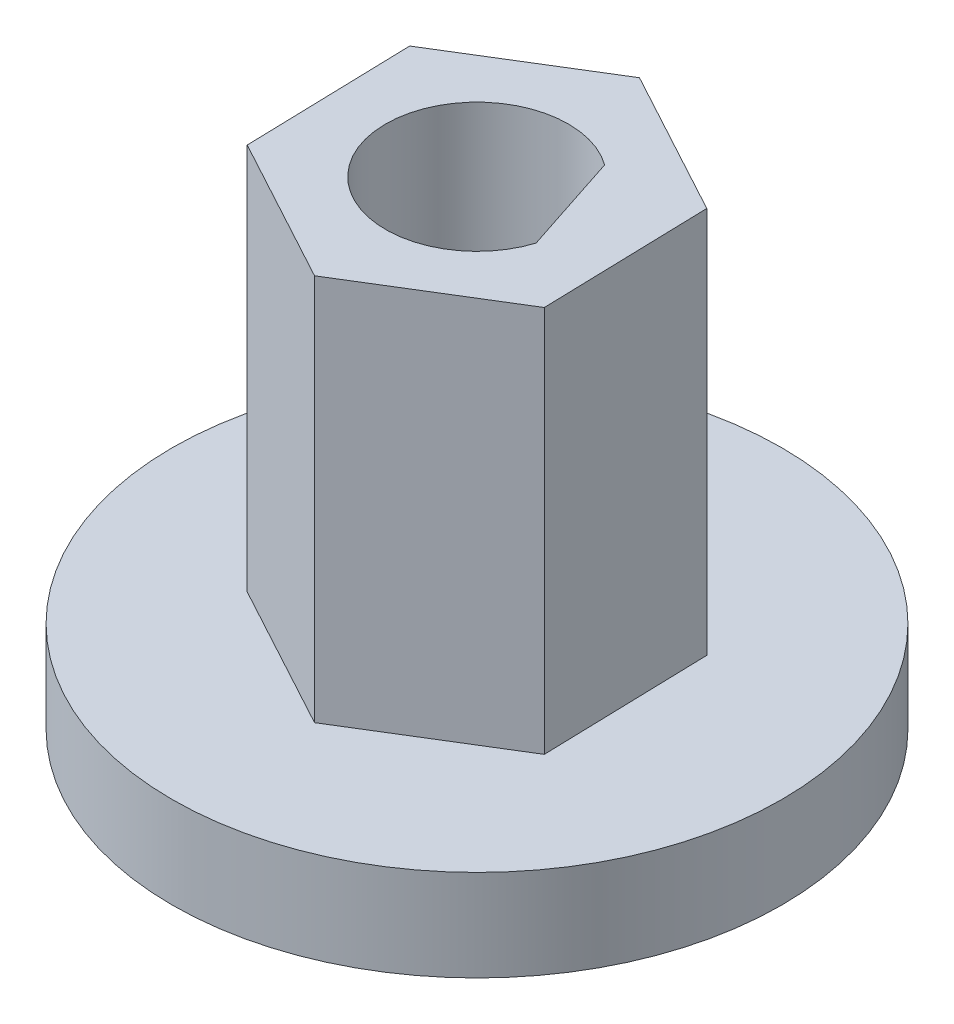
ISO-10303-21;
HEADER;
FILE_DESCRIPTION(('STEP AP214'),'2;1');
FILE_NAME('part.step','',(''),(''),'','','');
FILE_SCHEMA(('AUTOMOTIVE_DESIGN { 1 0 10303 214 1 1 1 1 }'));
ENDSEC;
DATA;
#1=APPLICATION_CONTEXT('core data for automotive mechanical design processes');
#2=APPLICATION_PROTOCOL_DEFINITION('international standard','automotive_design',2000,#1);
#3=PRODUCT_CONTEXT('',#1,'mechanical');
#4=PRODUCT('Part','Part','',(#3));
#5=PRODUCT_RELATED_PRODUCT_CATEGORY('part','',(#4));
#6=PRODUCT_DEFINITION_FORMATION('','',#4);
#7=PRODUCT_DEFINITION_CONTEXT('part definition',#1,'design');
#8=PRODUCT_DEFINITION('design','',#6,#7);
#9=PRODUCT_DEFINITION_SHAPE('','',#8);
#10=(LENGTH_UNIT() NAMED_UNIT(*) SI_UNIT(.MILLI.,.METRE.));
#11=(NAMED_UNIT(*) PLANE_ANGLE_UNIT() SI_UNIT($,.RADIAN.));
#12=(NAMED_UNIT(*) SI_UNIT($,.STERADIAN.) SOLID_ANGLE_UNIT());
#13=UNCERTAINTY_MEASURE_WITH_UNIT(LENGTH_MEASURE(1.E-05),#10,'distance_accuracy_value','');
#14=(GEOMETRIC_REPRESENTATION_CONTEXT(3) GLOBAL_UNCERTAINTY_ASSIGNED_CONTEXT((#13)) GLOBAL_UNIT_ASSIGNED_CONTEXT((#10,
#11,#12)) REPRESENTATION_CONTEXT('',''));
#15=CARTESIAN_POINT('',(0.,0.,0.));
#16=DIRECTION('',(0.,0.,1.));
#17=DIRECTION('',(1.,0.,0.));
#18=AXIS2_PLACEMENT_3D('',#15,#16,#17);
#19=CARTESIAN_POINT('',(0.,0.,0.));
#20=DIRECTION('',(0.,1.,0.));
#21=DIRECTION('',(0.,0.,1.));
#22=AXIS2_PLACEMENT_3D('',#19,#20,#21);
#23=PLANE('',#22);
#24=CARTESIAN_POINT('',(0.,0.,0.));
#25=DIRECTION('',(0.,1.,0.));
#26=DIRECTION('',(0.,0.,1.));
#27=AXIS2_PLACEMENT_3D('',#24,#25,#26);
#28=CIRCLE('',#27,10.);
#29=CARTESIAN_POINT('',(0.,0.,10.));
#30=VERTEX_POINT('',#29);
#31=EDGE_CURVE('E37',#30,#30,#28,.T.);
#32=ORIENTED_EDGE('',*,*,#31,.F.);
#33=EDGE_LOOP('',(#32));
#34=FACE_BOUND('',#33,.T.);
#35=DIRECTION('',(0.311402298469126,0.,0.950278174277482));
#36=VECTOR('',#35,1.);
#37=CARTESIAN_POINT('',(2.30686637596834,0.,-0.755950742827355));
#38=LINE('',#37,#36);
#39=CARTESIAN_POINT('',(1.75797567842878,0.,-2.43095074282736));
#40=VERTEX_POINT('',#39);
#41=CARTESIAN_POINT('',(2.8557570735079,0.,0.919049257172645));
#42=VERTEX_POINT('',#41);
#43=EDGE_CURVE('E98',#40,#42,#38,.T.);
#44=ORIENTED_EDGE('',*,*,#43,.F.);
#45=CARTESIAN_POINT('',(0.,0.,0.));
#46=DIRECTION('',(0.,1.,0.));
#47=DIRECTION('',(0.,0.,1.));
#48=AXIS2_PLACEMENT_3D('',#45,#46,#47);
#49=CIRCLE('',#48,3.);
#50=EDGE_CURVE('E100',#40,#42,#49,.T.);
#51=ORIENTED_EDGE('',*,*,#50,.T.);
#52=EDGE_LOOP('',(#44,#51));
#53=FACE_BOUND('',#52,.T.);
#54=ADVANCED_FACE('F33',(#34,#53),#23,.F.);
#55=CARTESIAN_POINT('',(0.,15.7,0.));
#56=DIRECTION('',(0.,1.,0.));
#57=DIRECTION('',(0.,0.,1.));
#58=AXIS2_PLACEMENT_3D('',#55,#56,#57);
#59=PLANE('',#58);
#60=DIRECTION('',(0.879285702622515,0.,0.476294712508579));
#61=VECTOR('',#60,1.);
#62=CARTESIAN_POINT('',(-4.67137463720313,15.7,2.86894178717555));
#63=LINE('',#62,#61);
#64=CARTESIAN_POINT('',(-4.67137463720313,15.7,2.86894178717555));
#65=VERTEX_POINT('',#64);
#66=CARTESIAN_POINT('',(0.148889151071193,15.7,5.48));
#67=VERTEX_POINT('',#66);
#68=EDGE_CURVE('E115',#65,#67,#63,.T.);
#69=ORIENTED_EDGE('',*,*,#68,.T.);
#70=DIRECTION('',(0.852126172031893,0.,-0.523336399401258));
#71=VECTOR('',#70,1.);
#72=CARTESIAN_POINT('',(0.148889151071193,15.7,5.48));
#73=LINE('',#72,#71);
#74=CARTESIAN_POINT('',(4.82026378827432,15.7,2.61105821282444));
#75=VERTEX_POINT('',#74);
#76=EDGE_CURVE('E118',#67,#75,#73,.T.);
#77=ORIENTED_EDGE('',*,*,#76,.T.);
#78=DIRECTION('',(-0.0271595305906223,0.,-0.999631111909837));
#79=VECTOR('',#78,1.);
#80=CARTESIAN_POINT('',(4.82026378827432,15.7,2.61105821282444));
#81=LINE('',#80,#79);
#82=CARTESIAN_POINT('',(4.67137463720313,15.7,-2.86894178717556));
#83=VERTEX_POINT('',#82);
#84=EDGE_CURVE('E121',#75,#83,#81,.T.);
#85=ORIENTED_EDGE('',*,*,#84,.T.);
#86=DIRECTION('',(-0.879285702622515,0.,-0.476294712508579));
#87=VECTOR('',#86,1.);
#88=CARTESIAN_POINT('',(4.67137463720313,15.7,-2.86894178717556));
#89=LINE('',#88,#87);
#90=CARTESIAN_POINT('',(-0.148889151071193,15.7,-5.48));
#91=VERTEX_POINT('',#90);
#92=EDGE_CURVE('E123',#83,#91,#89,.T.);
#93=ORIENTED_EDGE('',*,*,#92,.T.);
#94=DIRECTION('',(-0.852126172031893,0.,0.523336399401258));
#95=VECTOR('',#94,1.);
#96=CARTESIAN_POINT('',(-0.148889151071193,15.7,-5.48));
#97=LINE('',#96,#95);
#98=CARTESIAN_POINT('',(-4.82026378827432,15.7,-2.61105821282445));
#99=VERTEX_POINT('',#98);
#100=EDGE_CURVE('E125',#91,#99,#97,.T.);
#101=ORIENTED_EDGE('',*,*,#100,.T.);
#102=DIRECTION('',(0.0271595305906223,0.,0.999631111909837));
#103=VECTOR('',#102,1.);
#104=CARTESIAN_POINT('',(-4.82026378827432,15.7,-2.61105821282445));
#105=LINE('',#104,#103);
#106=EDGE_CURVE('E127',#99,#65,#105,.T.);
#107=ORIENTED_EDGE('',*,*,#106,.T.);
#108=EDGE_LOOP('',(#69,#77,#85,#93,#101,#107));
#109=FACE_BOUND('',#108,.T.);
#110=CARTESIAN_POINT('',(0.,15.7,0.));
#111=DIRECTION('',(0.,1.,0.));
#112=DIRECTION('',(0.,0.,1.));
#113=AXIS2_PLACEMENT_3D('',#110,#111,#112);
#114=CIRCLE('',#113,3.);
#115=CARTESIAN_POINT('',(1.75797567842878,15.7,-2.43095074282736));
#116=VERTEX_POINT('',#115);
#117=CARTESIAN_POINT('',(2.8557570735079,15.7,0.919049257172645));
#118=VERTEX_POINT('',#117);
#119=EDGE_CURVE('E104',#116,#118,#114,.T.);
#120=ORIENTED_EDGE('',*,*,#119,.F.);
#121=DIRECTION('',(0.311402298469126,0.,0.950278174277482));
#122=VECTOR('',#121,1.);
#123=CARTESIAN_POINT('',(2.30686637596834,15.7,-0.755950742827355));
#124=LINE('',#123,#122);
#125=EDGE_CURVE('E55',#116,#118,#124,.T.);
#126=ORIENTED_EDGE('',*,*,#125,.T.);
#127=EDGE_LOOP('',(#120,#126));
#128=FACE_BOUND('',#127,.T.);
#129=ADVANCED_FACE('F108',(#109,#128),#59,.T.);
#130=CARTESIAN_POINT('',(0.,3.,0.));
#131=DIRECTION('',(0.,-1.,0.));
#132=DIRECTION('',(0.,0.,-1.));
#133=AXIS2_PLACEMENT_3D('',#130,#131,#132);
#134=CYLINDRICAL_SURFACE('',#133,10.);
#135=CARTESIAN_POINT('',(0.,3.,0.));
#136=DIRECTION('',(0.,1.,0.));
#137=DIRECTION('',(0.,0.,1.));
#138=AXIS2_PLACEMENT_3D('',#135,#136,#137);
#139=CIRCLE('',#138,10.);
#140=CARTESIAN_POINT('',(0.,3.,10.));
#141=VERTEX_POINT('',#140);
#142=EDGE_CURVE('E11',#141,#141,#139,.T.);
#143=ORIENTED_EDGE('',*,*,#142,.F.);
#144=EDGE_LOOP('',(#143));
#145=FACE_BOUND('',#144,.T.);
#146=ORIENTED_EDGE('',*,*,#31,.T.);
#147=EDGE_LOOP('',(#146));
#148=FACE_BOUND('',#147,.T.);
#149=ADVANCED_FACE('F35',(#145,#148),#134,.T.);
#150=CARTESIAN_POINT('',(0.,3.,0.));
#151=DIRECTION('',(0.,1.,0.));
#152=DIRECTION('',(0.,0.,1.));
#153=AXIS2_PLACEMENT_3D('',#150,#151,#152);
#154=PLANE('',#153);
#155=DIRECTION('',(0.879285702622515,0.,0.476294712508579));
#156=VECTOR('',#155,1.);
#157=CARTESIAN_POINT('',(-4.67137463720313,3.,2.86894178717555));
#158=LINE('',#157,#156);
#159=CARTESIAN_POINT('',(-4.67137463720313,3.,2.86894178717555));
#160=VERTEX_POINT('',#159);
#161=CARTESIAN_POINT('',(0.148889151071193,3.,5.48));
#162=VERTEX_POINT('',#161);
#163=EDGE_CURVE('E114',#160,#162,#158,.T.);
#164=ORIENTED_EDGE('',*,*,#163,.F.);
#165=DIRECTION('',(0.0271595305906223,0.,0.999631111909837));
#166=VECTOR('',#165,1.);
#167=CARTESIAN_POINT('',(-4.82026378827432,3.,-2.61105821282445));
#168=LINE('',#167,#166);
#169=CARTESIAN_POINT('',(-4.82026378827432,3.,-2.61105821282445));
#170=VERTEX_POINT('',#169);
#171=EDGE_CURVE('E119',#170,#160,#168,.T.);
#172=ORIENTED_EDGE('',*,*,#171,.F.);
#173=DIRECTION('',(-0.852126172031893,0.,0.523336399401258));
#174=VECTOR('',#173,1.);
#175=CARTESIAN_POINT('',(-0.148889151071193,3.,-5.48));
#176=LINE('',#175,#174);
#177=CARTESIAN_POINT('',(-0.148889151071193,3.,-5.48));
#178=VERTEX_POINT('',#177);
#179=EDGE_CURVE('E141',#178,#170,#176,.T.);
#180=ORIENTED_EDGE('',*,*,#179,.F.);
#181=DIRECTION('',(-0.879285702622515,0.,-0.476294712508579));
#182=VECTOR('',#181,1.);
#183=CARTESIAN_POINT('',(4.67137463720313,3.,-2.86894178717556));
#184=LINE('',#183,#182);
#185=CARTESIAN_POINT('',(4.67137463720313,3.,-2.86894178717556));
#186=VERTEX_POINT('',#185);
#187=EDGE_CURVE('E138',#186,#178,#184,.T.);
#188=ORIENTED_EDGE('',*,*,#187,.F.);
#189=DIRECTION('',(-0.0271595305906223,0.,-0.999631111909837));
#190=VECTOR('',#189,1.);
#191=CARTESIAN_POINT('',(4.82026378827432,3.,2.61105821282444));
#192=LINE('',#191,#190);
#193=CARTESIAN_POINT('',(4.82026378827432,3.,2.61105821282444));
#194=VERTEX_POINT('',#193);
#195=EDGE_CURVE('E135',#194,#186,#192,.T.);
#196=ORIENTED_EDGE('',*,*,#195,.F.);
#197=DIRECTION('',(0.852126172031893,0.,-0.523336399401258));
#198=VECTOR('',#197,1.);
#199=CARTESIAN_POINT('',(0.148889151071193,3.,5.48));
#200=LINE('',#199,#198);
#201=EDGE_CURVE('E132',#162,#194,#200,.T.);
#202=ORIENTED_EDGE('',*,*,#201,.F.);
#203=EDGE_LOOP('',(#164,#172,#180,#188,#196,#202));
#204=FACE_BOUND('',#203,.T.);
#205=ORIENTED_EDGE('',*,*,#142,.T.);
#206=EDGE_LOOP('',(#205));
#207=FACE_BOUND('',#206,.T.);
#208=ADVANCED_FACE('F177',(#204,#207),#154,.T.);
#209=CARTESIAN_POINT('',(-4.67137463720313,15.7,2.86894178717555));
#210=DIRECTION('',(0.476294712508579,0.,-0.879285702622515));
#211=DIRECTION('',(-0.879285702622515,0.,-0.476294712508579));
#212=AXIS2_PLACEMENT_3D('',#209,#210,#211);
#213=PLANE('',#212);
#214=ORIENTED_EDGE('',*,*,#163,.T.);
#215=DIRECTION('',(0.,-1.,0.));
#216=VECTOR('',#215,1.);
#217=CARTESIAN_POINT('',(0.148889151071193,15.7,5.48));
#218=LINE('',#217,#216);
#219=EDGE_CURVE('E160',#67,#162,#218,.T.);
#220=ORIENTED_EDGE('',*,*,#219,.F.);
#221=ORIENTED_EDGE('',*,*,#68,.F.);
#222=DIRECTION('',(0.,-1.,0.));
#223=VECTOR('',#222,1.);
#224=CARTESIAN_POINT('',(-4.67137463720313,15.7,2.86894178717555));
#225=LINE('',#224,#223);
#226=EDGE_CURVE('E129',#65,#160,#225,.T.);
#227=ORIENTED_EDGE('',*,*,#226,.T.);
#228=EDGE_LOOP('',(#214,#220,#221,#227));
#229=FACE_BOUND('',#228,.T.);
#230=ADVANCED_FACE('F180',(#229),#213,.F.);
#231=CARTESIAN_POINT('',(0.148889151071193,15.7,5.48));
#232=DIRECTION('',(-0.523336399401258,0.,-0.852126172031893));
#233=DIRECTION('',(-0.852126172031893,0.,0.523336399401258));
#234=AXIS2_PLACEMENT_3D('',#231,#232,#233);
#235=PLANE('',#234);
#236=ORIENTED_EDGE('',*,*,#201,.T.);
#237=DIRECTION('',(0.,-1.,0.));
#238=VECTOR('',#237,1.);
#239=CARTESIAN_POINT('',(4.82026378827432,15.7,2.61105821282444));
#240=LINE('',#239,#238);
#241=EDGE_CURVE('E157',#75,#194,#240,.T.);
#242=ORIENTED_EDGE('',*,*,#241,.F.);
#243=ORIENTED_EDGE('',*,*,#76,.F.);
#244=ORIENTED_EDGE('',*,*,#219,.T.);
#245=EDGE_LOOP('',(#236,#242,#243,#244));
#246=FACE_BOUND('',#245,.T.);
#247=ADVANCED_FACE('F184',(#246),#235,.F.);
#248=CARTESIAN_POINT('',(4.82026378827432,15.7,2.61105821282444));
#249=DIRECTION('',(-0.999631111909837,0.,0.0271595305906223));
#250=DIRECTION('',(0.0271595305906223,0.,0.999631111909837));
#251=AXIS2_PLACEMENT_3D('',#248,#249,#250);
#252=PLANE('',#251);
#253=ORIENTED_EDGE('',*,*,#195,.T.);
#254=DIRECTION('',(0.,-1.,0.));
#255=VECTOR('',#254,1.);
#256=CARTESIAN_POINT('',(4.67137463720313,15.7,-2.86894178717556));
#257=LINE('',#256,#255);
#258=EDGE_CURVE('E154',#83,#186,#257,.T.);
#259=ORIENTED_EDGE('',*,*,#258,.F.);
#260=ORIENTED_EDGE('',*,*,#84,.F.);
#261=ORIENTED_EDGE('',*,*,#241,.T.);
#262=EDGE_LOOP('',(#253,#259,#260,#261));
#263=FACE_BOUND('',#262,.T.);
#264=ADVANCED_FACE('F188',(#263),#252,.F.);
#265=CARTESIAN_POINT('',(4.67137463720313,15.7,-2.86894178717556));
#266=DIRECTION('',(-0.476294712508579,0.,0.879285702622515));
#267=DIRECTION('',(0.879285702622515,0.,0.476294712508579));
#268=AXIS2_PLACEMENT_3D('',#265,#266,#267);
#269=PLANE('',#268);
#270=ORIENTED_EDGE('',*,*,#187,.T.);
#271=DIRECTION('',(0.,-1.,0.));
#272=VECTOR('',#271,1.);
#273=CARTESIAN_POINT('',(-0.148889151071193,15.7,-5.48));
#274=LINE('',#273,#272);
#275=EDGE_CURVE('E151',#91,#178,#274,.T.);
#276=ORIENTED_EDGE('',*,*,#275,.F.);
#277=ORIENTED_EDGE('',*,*,#92,.F.);
#278=ORIENTED_EDGE('',*,*,#258,.T.);
#279=EDGE_LOOP('',(#270,#276,#277,#278));
#280=FACE_BOUND('',#279,.T.);
#281=ADVANCED_FACE('F191',(#280),#269,.F.);
#282=CARTESIAN_POINT('',(-0.148889151071193,15.7,-5.48));
#283=DIRECTION('',(0.523336399401258,0.,0.852126172031893));
#284=DIRECTION('',(0.852126172031893,0.,-0.523336399401258));
#285=AXIS2_PLACEMENT_3D('',#282,#283,#284);
#286=PLANE('',#285);
#287=ORIENTED_EDGE('',*,*,#179,.T.);
#288=DIRECTION('',(0.,-1.,0.));
#289=VECTOR('',#288,1.);
#290=CARTESIAN_POINT('',(-4.82026378827432,15.7,-2.61105821282445));
#291=LINE('',#290,#289);
#292=EDGE_CURVE('E148',#99,#170,#291,.T.);
#293=ORIENTED_EDGE('',*,*,#292,.F.);
#294=ORIENTED_EDGE('',*,*,#100,.F.);
#295=ORIENTED_EDGE('',*,*,#275,.T.);
#296=EDGE_LOOP('',(#287,#293,#294,#295));
#297=FACE_BOUND('',#296,.T.);
#298=ADVANCED_FACE('F195',(#297),#286,.F.);
#299=CARTESIAN_POINT('',(-4.82026378827432,15.7,-2.61105821282445));
#300=DIRECTION('',(0.999631111909837,0.,-0.0271595305906223));
#301=DIRECTION('',(-0.0271595305906223,0.,-0.999631111909837));
#302=AXIS2_PLACEMENT_3D('',#299,#300,#301);
#303=PLANE('',#302);
#304=ORIENTED_EDGE('',*,*,#171,.T.);
#305=ORIENTED_EDGE('',*,*,#226,.F.);
#306=ORIENTED_EDGE('',*,*,#106,.F.);
#307=ORIENTED_EDGE('',*,*,#292,.T.);
#308=EDGE_LOOP('',(#304,#305,#306,#307));
#309=FACE_BOUND('',#308,.T.);
#310=ADVANCED_FACE('F199',(#309),#303,.F.);
#311=CARTESIAN_POINT('',(2.30686637596834,-7.3,-0.755950742827355));
#312=DIRECTION('',(-0.950278174277482,0.,0.311402298469126));
#313=DIRECTION('',(0.311402298469126,0.,0.950278174277482));
#314=AXIS2_PLACEMENT_3D('',#311,#312,#313);
#315=PLANE('',#314);
#316=ORIENTED_EDGE('',*,*,#43,.T.);
#317=DIRECTION('',(0.,1.,0.));
#318=VECTOR('',#317,1.);
#319=CARTESIAN_POINT('',(2.8557570735079,-7.3,0.919049257172645));
#320=LINE('',#319,#318);
#321=EDGE_CURVE('E48',#42,#118,#320,.T.);
#322=ORIENTED_EDGE('',*,*,#321,.T.);
#323=ORIENTED_EDGE('',*,*,#125,.F.);
#324=DIRECTION('',(0.,1.,0.));
#325=VECTOR('',#324,1.);
#326=CARTESIAN_POINT('',(1.75797567842878,-7.3,-2.43095074282736));
#327=LINE('',#326,#325);
#328=EDGE_CURVE('E101',#40,#116,#327,.T.);
#329=ORIENTED_EDGE('',*,*,#328,.F.);
#330=EDGE_LOOP('',(#316,#322,#323,#329));
#331=FACE_BOUND('',#330,.T.);
#332=ADVANCED_FACE('F96',(#331),#315,.T.);
#333=CARTESIAN_POINT('',(0.,-7.3,0.));
#334=DIRECTION('',(0.,1.,0.));
#335=DIRECTION('',(0.,0.,1.));
#336=AXIS2_PLACEMENT_3D('',#333,#334,#335);
#337=CYLINDRICAL_SURFACE('',#336,3.);
#338=ORIENTED_EDGE('',*,*,#328,.T.);
#339=ORIENTED_EDGE('',*,*,#119,.T.);
#340=ORIENTED_EDGE('',*,*,#321,.F.);
#341=ORIENTED_EDGE('',*,*,#50,.F.);
#342=EDGE_LOOP('',(#338,#339,#340,#341));
#343=FACE_BOUND('',#342,.T.);
#344=ADVANCED_FACE('F105',(#343),#337,.F.);
#345=CLOSED_SHELL('',(#54,#129,#149,#208,#230,#247,#264,#281,#298,#310,#332,#344));
#346=MANIFOLD_SOLID_BREP('B2',#345);
#347=ADVANCED_BREP_SHAPE_REPRESENTATION('',(#18,#346),#14);
#348=SHAPE_DEFINITION_REPRESENTATION(#9,#347);
ENDSEC;
END-ISO-10303-21;
